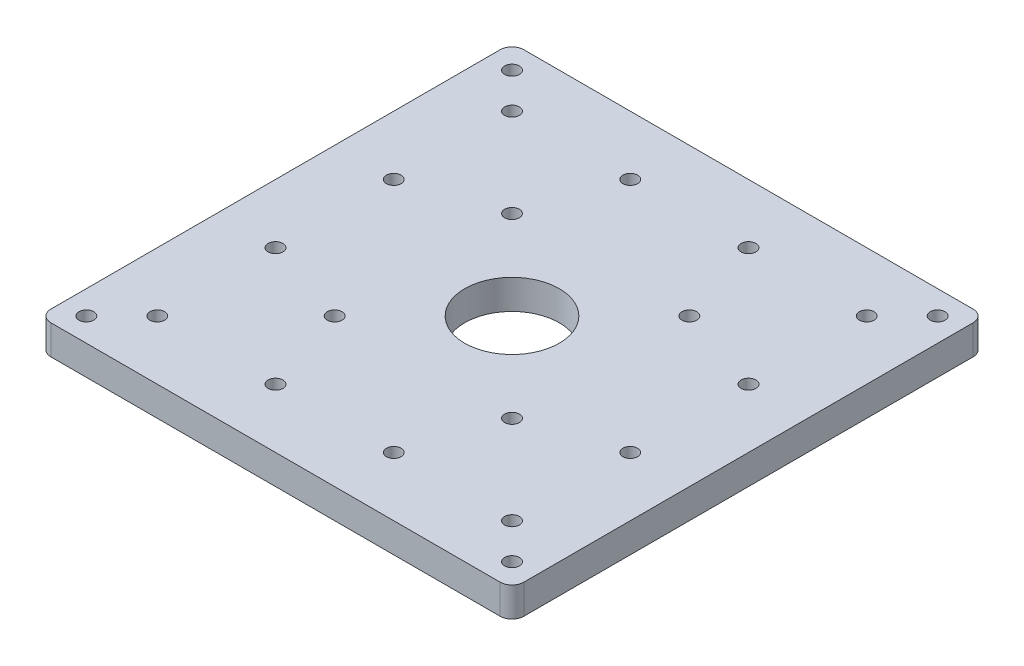
ISO-10303-21;
HEADER;
FILE_DESCRIPTION(('STEP AP214'),'2;1');
FILE_NAME('part.step','',(''),(''),'','','');
FILE_SCHEMA(('AUTOMOTIVE_DESIGN { 1 0 10303 214 1 1 1 1 }'));
ENDSEC;
DATA;
#1=APPLICATION_CONTEXT('core data for automotive mechanical design processes');
#2=APPLICATION_PROTOCOL_DEFINITION('international standard','automotive_design',2000,#1);
#3=PRODUCT_CONTEXT('',#1,'mechanical');
#4=PRODUCT('Part','Part','',(#3));
#5=PRODUCT_RELATED_PRODUCT_CATEGORY('part','',(#4));
#6=PRODUCT_DEFINITION_FORMATION('','',#4);
#7=PRODUCT_DEFINITION_CONTEXT('part definition',#1,'design');
#8=PRODUCT_DEFINITION('design','',#6,#7);
#9=PRODUCT_DEFINITION_SHAPE('','',#8);
#10=(LENGTH_UNIT() NAMED_UNIT(*) SI_UNIT(.MILLI.,.METRE.));
#11=(NAMED_UNIT(*) PLANE_ANGLE_UNIT() SI_UNIT($,.RADIAN.));
#12=(NAMED_UNIT(*) SI_UNIT($,.STERADIAN.) SOLID_ANGLE_UNIT());
#13=UNCERTAINTY_MEASURE_WITH_UNIT(LENGTH_MEASURE(1.E-05),#10,'distance_accuracy_value','');
#14=(GEOMETRIC_REPRESENTATION_CONTEXT(3) GLOBAL_UNCERTAINTY_ASSIGNED_CONTEXT((#13)) GLOBAL_UNIT_ASSIGNED_CONTEXT((#10,
#11,#12)) REPRESENTATION_CONTEXT('',''));
#15=CARTESIAN_POINT('',(0.,0.,0.));
#16=DIRECTION('',(0.,0.,1.));
#17=DIRECTION('',(1.,0.,0.));
#18=AXIS2_PLACEMENT_3D('',#15,#16,#17);
#19=CARTESIAN_POINT('',(-40.,5.,40.));
#20=DIRECTION('',(0.,1.,0.));
#21=DIRECTION('',(0.,0.,1.));
#22=AXIS2_PLACEMENT_3D('',#19,#20,#21);
#23=PLANE('',#22);
#24=CARTESIAN_POINT('',(30.,5.,30.));
#25=DIRECTION('',(0.,1.,0.));
#26=DIRECTION('',(0.,0.,1.));
#27=AXIS2_PLACEMENT_3D('',#24,#25,#26);
#28=CIRCLE('',#27,1.25);
#29=CARTESIAN_POINT('',(30.,5.,31.25));
#30=VERTEX_POINT('',#29);
#31=EDGE_CURVE('E301',#30,#30,#28,.T.);
#32=ORIENTED_EDGE('',*,*,#31,.F.);
#33=EDGE_LOOP('',(#32));
#34=FACE_BOUND('',#33,.T.);
#35=CARTESIAN_POINT('',(10.,5.,30.));
#36=DIRECTION('',(0.,1.,0.));
#37=DIRECTION('',(0.,0.,1.));
#38=AXIS2_PLACEMENT_3D('',#35,#36,#37);
#39=CIRCLE('',#38,1.25);
#40=CARTESIAN_POINT('',(10.,5.,31.25));
#41=VERTEX_POINT('',#40);
#42=EDGE_CURVE('E295',#41,#41,#39,.T.);
#43=ORIENTED_EDGE('',*,*,#42,.F.);
#44=EDGE_LOOP('',(#43));
#45=FACE_BOUND('',#44,.T.);
#46=CARTESIAN_POINT('',(-10.,5.,30.));
#47=DIRECTION('',(0.,1.,0.));
#48=DIRECTION('',(0.,0.,1.));
#49=AXIS2_PLACEMENT_3D('',#46,#47,#48);
#50=CIRCLE('',#49,1.25);
#51=CARTESIAN_POINT('',(-10.,5.,31.25));
#52=VERTEX_POINT('',#51);
#53=EDGE_CURVE('E289',#52,#52,#50,.T.);
#54=ORIENTED_EDGE('',*,*,#53,.F.);
#55=EDGE_LOOP('',(#54));
#56=FACE_BOUND('',#55,.T.);
#57=CARTESIAN_POINT('',(-30.,5.,30.));
#58=DIRECTION('',(0.,1.,0.));
#59=DIRECTION('',(0.,0.,1.));
#60=AXIS2_PLACEMENT_3D('',#57,#58,#59);
#61=CIRCLE('',#60,1.25);
#62=CARTESIAN_POINT('',(-30.,5.,31.25));
#63=VERTEX_POINT('',#62);
#64=EDGE_CURVE('E283',#63,#63,#61,.T.);
#65=ORIENTED_EDGE('',*,*,#64,.F.);
#66=EDGE_LOOP('',(#65));
#67=FACE_BOUND('',#66,.T.);
#68=CARTESIAN_POINT('',(30.,5.,10.));
#69=DIRECTION('',(0.,1.,0.));
#70=DIRECTION('',(0.,0.,1.));
#71=AXIS2_PLACEMENT_3D('',#68,#69,#70);
#72=CIRCLE('',#71,1.25);
#73=CARTESIAN_POINT('',(30.,5.,11.25));
#74=VERTEX_POINT('',#73);
#75=EDGE_CURVE('E277',#74,#74,#72,.T.);
#76=ORIENTED_EDGE('',*,*,#75,.F.);
#77=EDGE_LOOP('',(#76));
#78=FACE_BOUND('',#77,.T.);
#79=CARTESIAN_POINT('',(-30.,5.,10.));
#80=DIRECTION('',(0.,1.,0.));
#81=DIRECTION('',(0.,0.,1.));
#82=AXIS2_PLACEMENT_3D('',#79,#80,#81);
#83=CIRCLE('',#82,1.25);
#84=CARTESIAN_POINT('',(-30.,5.,11.25));
#85=VERTEX_POINT('',#84);
#86=EDGE_CURVE('E271',#85,#85,#83,.T.);
#87=ORIENTED_EDGE('',*,*,#86,.F.);
#88=EDGE_LOOP('',(#87));
#89=FACE_BOUND('',#88,.T.);
#90=CARTESIAN_POINT('',(30.,5.,-9.99999999999999));
#91=DIRECTION('',(0.,1.,0.));
#92=DIRECTION('',(0.,0.,1.));
#93=AXIS2_PLACEMENT_3D('',#90,#91,#92);
#94=CIRCLE('',#93,1.25);
#95=CARTESIAN_POINT('',(30.,5.,-8.75));
#96=VERTEX_POINT('',#95);
#97=EDGE_CURVE('E265',#96,#96,#94,.T.);
#98=ORIENTED_EDGE('',*,*,#97,.F.);
#99=EDGE_LOOP('',(#98));
#100=FACE_BOUND('',#99,.T.);
#101=CARTESIAN_POINT('',(-30.,5.,-10.));
#102=DIRECTION('',(0.,1.,0.));
#103=DIRECTION('',(0.,0.,1.));
#104=AXIS2_PLACEMENT_3D('',#101,#102,#103);
#105=CIRCLE('',#104,1.25);
#106=CARTESIAN_POINT('',(-30.,5.,-8.75));
#107=VERTEX_POINT('',#106);
#108=EDGE_CURVE('E259',#107,#107,#105,.T.);
#109=ORIENTED_EDGE('',*,*,#108,.F.);
#110=EDGE_LOOP('',(#109));
#111=FACE_BOUND('',#110,.T.);
#112=CARTESIAN_POINT('',(30.,5.,-30.));
#113=DIRECTION('',(0.,1.,0.));
#114=DIRECTION('',(0.,0.,1.));
#115=AXIS2_PLACEMENT_3D('',#112,#113,#114);
#116=CIRCLE('',#115,1.25);
#117=CARTESIAN_POINT('',(30.,5.,-28.75));
#118=VERTEX_POINT('',#117);
#119=EDGE_CURVE('E253',#118,#118,#116,.T.);
#120=ORIENTED_EDGE('',*,*,#119,.F.);
#121=EDGE_LOOP('',(#120));
#122=FACE_BOUND('',#121,.T.);
#123=CARTESIAN_POINT('',(10.,5.,-30.));
#124=DIRECTION('',(0.,1.,0.));
#125=DIRECTION('',(0.,0.,1.));
#126=AXIS2_PLACEMENT_3D('',#123,#124,#125);
#127=CIRCLE('',#126,1.25);
#128=CARTESIAN_POINT('',(10.,5.,-28.75));
#129=VERTEX_POINT('',#128);
#130=EDGE_CURVE('E247',#129,#129,#127,.T.);
#131=ORIENTED_EDGE('',*,*,#130,.F.);
#132=EDGE_LOOP('',(#131));
#133=FACE_BOUND('',#132,.T.);
#134=CARTESIAN_POINT('',(-10.,5.,-30.));
#135=DIRECTION('',(0.,1.,0.));
#136=DIRECTION('',(0.,0.,1.));
#137=AXIS2_PLACEMENT_3D('',#134,#135,#136);
#138=CIRCLE('',#137,1.25);
#139=CARTESIAN_POINT('',(-10.,5.,-28.75));
#140=VERTEX_POINT('',#139);
#141=EDGE_CURVE('E241',#140,#140,#138,.T.);
#142=ORIENTED_EDGE('',*,*,#141,.F.);
#143=EDGE_LOOP('',(#142));
#144=FACE_BOUND('',#143,.T.);
#145=CARTESIAN_POINT('',(-30.,5.,-30.));
#146=DIRECTION('',(0.,1.,0.));
#147=DIRECTION('',(0.,0.,1.));
#148=AXIS2_PLACEMENT_3D('',#145,#146,#147);
#149=CIRCLE('',#148,1.25);
#150=CARTESIAN_POINT('',(-30.,5.,-28.75));
#151=VERTEX_POINT('',#150);
#152=EDGE_CURVE('E235',#151,#151,#149,.T.);
#153=ORIENTED_EDGE('',*,*,#152,.F.);
#154=EDGE_LOOP('',(#153));
#155=FACE_BOUND('',#154,.T.);
#156=CARTESIAN_POINT('',(-36.,5.,36.));
#157=DIRECTION('',(0.,1.,0.));
#158=DIRECTION('',(0.,0.,-1.));
#159=AXIS2_PLACEMENT_3D('',#156,#157,#158);
#160=CIRCLE('',#159,1.25);
#161=CARTESIAN_POINT('',(-36.,5.,34.75));
#162=VERTEX_POINT('',#161);
#163=EDGE_CURVE('E220',#162,#162,#160,.T.);
#164=ORIENTED_EDGE('',*,*,#163,.F.);
#165=EDGE_LOOP('',(#164));
#166=FACE_BOUND('',#165,.T.);
#167=CARTESIAN_POINT('',(36.,5.,-36.));
#168=DIRECTION('',(0.,1.,0.));
#169=DIRECTION('',(0.,0.,-1.));
#170=AXIS2_PLACEMENT_3D('',#167,#168,#169);
#171=CIRCLE('',#170,1.25);
#172=CARTESIAN_POINT('',(36.,5.,-37.25));
#173=VERTEX_POINT('',#172);
#174=EDGE_CURVE('E208',#173,#173,#171,.T.);
#175=ORIENTED_EDGE('',*,*,#174,.F.);
#176=EDGE_LOOP('',(#175));
#177=FACE_BOUND('',#176,.T.);
#178=CARTESIAN_POINT('',(15.,5.,15.));
#179=DIRECTION('',(0.,1.,0.));
#180=DIRECTION('',(0.,0.,1.));
#181=AXIS2_PLACEMENT_3D('',#178,#179,#180);
#182=CIRCLE('',#181,1.25);
#183=CARTESIAN_POINT('',(15.,5.,16.25));
#184=VERTEX_POINT('',#183);
#185=EDGE_CURVE('E196',#184,#184,#182,.T.);
#186=ORIENTED_EDGE('',*,*,#185,.F.);
#187=EDGE_LOOP('',(#186));
#188=FACE_BOUND('',#187,.T.);
#189=CARTESIAN_POINT('',(15.,5.,-15.));
#190=DIRECTION('',(0.,1.,0.));
#191=DIRECTION('',(0.,0.,-1.));
#192=AXIS2_PLACEMENT_3D('',#189,#190,#191);
#193=CIRCLE('',#192,1.25);
#194=CARTESIAN_POINT('',(15.,5.,-16.25));
#195=VERTEX_POINT('',#194);
#196=EDGE_CURVE('E185',#195,#195,#193,.T.);
#197=ORIENTED_EDGE('',*,*,#196,.F.);
#198=EDGE_LOOP('',(#197));
#199=FACE_BOUND('',#198,.T.);
#200=DIRECTION('',(-1.,0.,0.));
#201=VECTOR('',#200,1.);
#202=CARTESIAN_POINT('',(-40.,5.,-40.));
#203=LINE('',#202,#201);
#204=CARTESIAN_POINT('',(38.,5.,-40.));
#205=VERTEX_POINT('',#204);
#206=CARTESIAN_POINT('',(-38.,5.,-40.));
#207=VERTEX_POINT('',#206);
#208=EDGE_CURVE('E140',#205,#207,#203,.T.);
#209=ORIENTED_EDGE('',*,*,#208,.T.);
#210=CARTESIAN_POINT('',(-38.,5.,-38.));
#211=DIRECTION('',(0.,1.,0.));
#212=DIRECTION('',(0.,0.,1.));
#213=AXIS2_PLACEMENT_3D('',#210,#211,#212);
#214=CIRCLE('',#213,2.);
#215=CARTESIAN_POINT('',(-40.,5.,-38.));
#216=VERTEX_POINT('',#215);
#217=EDGE_CURVE('E159',#207,#216,#214,.T.);
#218=ORIENTED_EDGE('',*,*,#217,.T.);
#219=DIRECTION('',(0.,0.,1.));
#220=VECTOR('',#219,1.);
#221=CARTESIAN_POINT('',(-40.,5.,-40.));
#222=LINE('',#221,#220);
#223=CARTESIAN_POINT('',(-40.,5.,38.));
#224=VERTEX_POINT('',#223);
#225=EDGE_CURVE('E123',#216,#224,#222,.T.);
#226=ORIENTED_EDGE('',*,*,#225,.T.);
#227=CARTESIAN_POINT('',(-38.,5.,38.));
#228=DIRECTION('',(0.,1.,0.));
#229=DIRECTION('',(0.,0.,1.));
#230=AXIS2_PLACEMENT_3D('',#227,#228,#229);
#231=CIRCLE('',#230,2.);
#232=CARTESIAN_POINT('',(-38.,5.,40.));
#233=VERTEX_POINT('',#232);
#234=EDGE_CURVE('E154',#224,#233,#231,.T.);
#235=ORIENTED_EDGE('',*,*,#234,.T.);
#236=DIRECTION('',(1.,0.,0.));
#237=VECTOR('',#236,1.);
#238=CARTESIAN_POINT('',(-40.,5.,40.));
#239=LINE('',#238,#237);
#240=CARTESIAN_POINT('',(38.,5.,40.));
#241=VERTEX_POINT('',#240);
#242=EDGE_CURVE('E170',#233,#241,#239,.T.);
#243=ORIENTED_EDGE('',*,*,#242,.T.);
#244=CARTESIAN_POINT('',(38.,5.,38.));
#245=DIRECTION('',(0.,1.,0.));
#246=DIRECTION('',(0.,0.,1.));
#247=AXIS2_PLACEMENT_3D('',#244,#245,#246);
#248=CIRCLE('',#247,2.);
#249=CARTESIAN_POINT('',(40.,5.,38.));
#250=VERTEX_POINT('',#249);
#251=EDGE_CURVE('E59',#241,#250,#248,.T.);
#252=ORIENTED_EDGE('',*,*,#251,.T.);
#253=DIRECTION('',(0.,0.,-1.));
#254=VECTOR('',#253,1.);
#255=CARTESIAN_POINT('',(40.,5.,-40.));
#256=LINE('',#255,#254);
#257=CARTESIAN_POINT('',(40.,5.,-38.));
#258=VERTEX_POINT('',#257);
#259=EDGE_CURVE('E178',#250,#258,#256,.T.);
#260=ORIENTED_EDGE('',*,*,#259,.T.);
#261=CARTESIAN_POINT('',(38.,5.,-38.));
#262=DIRECTION('',(0.,1.,0.));
#263=DIRECTION('',(0.,0.,1.));
#264=AXIS2_PLACEMENT_3D('',#261,#262,#263);
#265=CIRCLE('',#264,2.);
#266=EDGE_CURVE('E157',#258,#205,#265,.T.);
#267=ORIENTED_EDGE('',*,*,#266,.T.);
#268=EDGE_LOOP('',(#209,#218,#226,#235,#243,#252,#260,#267));
#269=FACE_BOUND('',#268,.T.);
#270=CARTESIAN_POINT('',(-15.,5.,-15.));
#271=DIRECTION('',(0.,1.,0.));
#272=DIRECTION('',(0.,0.,1.));
#273=AXIS2_PLACEMENT_3D('',#270,#271,#272);
#274=CIRCLE('',#273,1.25);
#275=CARTESIAN_POINT('',(-15.,5.,-13.75));
#276=VERTEX_POINT('',#275);
#277=EDGE_CURVE('E131',#276,#276,#274,.T.);
#278=ORIENTED_EDGE('',*,*,#277,.F.);
#279=EDGE_LOOP('',(#278));
#280=FACE_BOUND('',#279,.T.);
#281=CARTESIAN_POINT('',(-15.,5.,15.));
#282=DIRECTION('',(0.,1.,0.));
#283=DIRECTION('',(0.,0.,-1.));
#284=AXIS2_PLACEMENT_3D('',#281,#282,#283);
#285=CIRCLE('',#284,1.25);
#286=CARTESIAN_POINT('',(-15.,5.,13.75));
#287=VERTEX_POINT('',#286);
#288=EDGE_CURVE('E190',#287,#287,#285,.T.);
#289=ORIENTED_EDGE('',*,*,#288,.F.);
#290=EDGE_LOOP('',(#289));
#291=FACE_BOUND('',#290,.T.);
#292=CARTESIAN_POINT('',(-36.,5.,-36.));
#293=DIRECTION('',(0.,1.,0.));
#294=DIRECTION('',(0.,0.,1.));
#295=AXIS2_PLACEMENT_3D('',#292,#293,#294);
#296=CIRCLE('',#295,1.25);
#297=CARTESIAN_POINT('',(-36.,5.,-34.75));
#298=VERTEX_POINT('',#297);
#299=EDGE_CURVE('E202',#298,#298,#296,.T.);
#300=ORIENTED_EDGE('',*,*,#299,.F.);
#301=EDGE_LOOP('',(#300));
#302=FACE_BOUND('',#301,.T.);
#303=CARTESIAN_POINT('',(36.,5.,36.));
#304=DIRECTION('',(0.,1.,0.));
#305=DIRECTION('',(0.,0.,1.));
#306=AXIS2_PLACEMENT_3D('',#303,#304,#305);
#307=CIRCLE('',#306,1.25);
#308=CARTESIAN_POINT('',(36.,5.,37.25));
#309=VERTEX_POINT('',#308);
#310=EDGE_CURVE('E214',#309,#309,#307,.T.);
#311=ORIENTED_EDGE('',*,*,#310,.F.);
#312=EDGE_LOOP('',(#311));
#313=FACE_BOUND('',#312,.T.);
#314=CARTESIAN_POINT('',(0.,5.,0.));
#315=DIRECTION('',(0.,1.,0.));
#316=DIRECTION('',(0.,0.,1.));
#317=AXIS2_PLACEMENT_3D('',#314,#315,#316);
#318=CIRCLE('',#317,8.);
#319=CARTESIAN_POINT('',(0.,5.,8.));
#320=VERTEX_POINT('',#319);
#321=EDGE_CURVE('E226',#320,#320,#318,.T.);
#322=ORIENTED_EDGE('',*,*,#321,.F.);
#323=EDGE_LOOP('',(#322));
#324=FACE_BOUND('',#323,.T.);
#325=ADVANCED_FACE('F37',(#34,#45,#56,#67,#78,#89,#100,#111,#122,#133,#144,#155,#166,#177,#188,
#199,#269,#280,#291,#302,#313,#324),#23,.T.);
#326=CARTESIAN_POINT('',(-40.,0.,40.));
#327=DIRECTION('',(0.,1.,0.));
#328=DIRECTION('',(0.,0.,1.));
#329=AXIS2_PLACEMENT_3D('',#326,#327,#328);
#330=PLANE('',#329);
#331=CARTESIAN_POINT('',(30.,0.,30.));
#332=DIRECTION('',(0.,1.,0.));
#333=DIRECTION('',(0.,0.,1.));
#334=AXIS2_PLACEMENT_3D('',#331,#332,#333);
#335=CIRCLE('',#334,1.25);
#336=CARTESIAN_POINT('',(30.,0.,31.25));
#337=VERTEX_POINT('',#336);
#338=EDGE_CURVE('E298',#337,#337,#335,.T.);
#339=ORIENTED_EDGE('',*,*,#338,.T.);
#340=EDGE_LOOP('',(#339));
#341=FACE_BOUND('',#340,.T.);
#342=CARTESIAN_POINT('',(10.,0.,30.));
#343=DIRECTION('',(0.,1.,0.));
#344=DIRECTION('',(0.,0.,1.));
#345=AXIS2_PLACEMENT_3D('',#342,#343,#344);
#346=CIRCLE('',#345,1.25);
#347=CARTESIAN_POINT('',(10.,0.,31.25));
#348=VERTEX_POINT('',#347);
#349=EDGE_CURVE('E292',#348,#348,#346,.T.);
#350=ORIENTED_EDGE('',*,*,#349,.T.);
#351=EDGE_LOOP('',(#350));
#352=FACE_BOUND('',#351,.T.);
#353=CARTESIAN_POINT('',(-10.,0.,30.));
#354=DIRECTION('',(0.,1.,0.));
#355=DIRECTION('',(0.,0.,1.));
#356=AXIS2_PLACEMENT_3D('',#353,#354,#355);
#357=CIRCLE('',#356,1.25);
#358=CARTESIAN_POINT('',(-10.,0.,31.25));
#359=VERTEX_POINT('',#358);
#360=EDGE_CURVE('E286',#359,#359,#357,.T.);
#361=ORIENTED_EDGE('',*,*,#360,.T.);
#362=EDGE_LOOP('',(#361));
#363=FACE_BOUND('',#362,.T.);
#364=CARTESIAN_POINT('',(-30.,0.,30.));
#365=DIRECTION('',(0.,1.,0.));
#366=DIRECTION('',(0.,0.,1.));
#367=AXIS2_PLACEMENT_3D('',#364,#365,#366);
#368=CIRCLE('',#367,1.25);
#369=CARTESIAN_POINT('',(-30.,0.,31.25));
#370=VERTEX_POINT('',#369);
#371=EDGE_CURVE('E280',#370,#370,#368,.T.);
#372=ORIENTED_EDGE('',*,*,#371,.T.);
#373=EDGE_LOOP('',(#372));
#374=FACE_BOUND('',#373,.T.);
#375=CARTESIAN_POINT('',(30.,0.,10.));
#376=DIRECTION('',(0.,1.,0.));
#377=DIRECTION('',(0.,0.,1.));
#378=AXIS2_PLACEMENT_3D('',#375,#376,#377);
#379=CIRCLE('',#378,1.25);
#380=CARTESIAN_POINT('',(30.,0.,11.25));
#381=VERTEX_POINT('',#380);
#382=EDGE_CURVE('E274',#381,#381,#379,.T.);
#383=ORIENTED_EDGE('',*,*,#382,.T.);
#384=EDGE_LOOP('',(#383));
#385=FACE_BOUND('',#384,.T.);
#386=CARTESIAN_POINT('',(-30.,0.,10.));
#387=DIRECTION('',(0.,1.,0.));
#388=DIRECTION('',(0.,0.,1.));
#389=AXIS2_PLACEMENT_3D('',#386,#387,#388);
#390=CIRCLE('',#389,1.25);
#391=CARTESIAN_POINT('',(-30.,0.,11.25));
#392=VERTEX_POINT('',#391);
#393=EDGE_CURVE('E268',#392,#392,#390,.T.);
#394=ORIENTED_EDGE('',*,*,#393,.T.);
#395=EDGE_LOOP('',(#394));
#396=FACE_BOUND('',#395,.T.);
#397=CARTESIAN_POINT('',(30.,0.,-9.99999999999999));
#398=DIRECTION('',(0.,1.,0.));
#399=DIRECTION('',(0.,0.,1.));
#400=AXIS2_PLACEMENT_3D('',#397,#398,#399);
#401=CIRCLE('',#400,1.25);
#402=CARTESIAN_POINT('',(30.,0.,-8.75));
#403=VERTEX_POINT('',#402);
#404=EDGE_CURVE('E262',#403,#403,#401,.T.);
#405=ORIENTED_EDGE('',*,*,#404,.T.);
#406=EDGE_LOOP('',(#405));
#407=FACE_BOUND('',#406,.T.);
#408=CARTESIAN_POINT('',(-30.,0.,-10.));
#409=DIRECTION('',(0.,1.,0.));
#410=DIRECTION('',(0.,0.,1.));
#411=AXIS2_PLACEMENT_3D('',#408,#409,#410);
#412=CIRCLE('',#411,1.25);
#413=CARTESIAN_POINT('',(-30.,0.,-8.75));
#414=VERTEX_POINT('',#413);
#415=EDGE_CURVE('E256',#414,#414,#412,.T.);
#416=ORIENTED_EDGE('',*,*,#415,.T.);
#417=EDGE_LOOP('',(#416));
#418=FACE_BOUND('',#417,.T.);
#419=CARTESIAN_POINT('',(30.,0.,-30.));
#420=DIRECTION('',(0.,1.,0.));
#421=DIRECTION('',(0.,0.,1.));
#422=AXIS2_PLACEMENT_3D('',#419,#420,#421);
#423=CIRCLE('',#422,1.25);
#424=CARTESIAN_POINT('',(30.,0.,-28.75));
#425=VERTEX_POINT('',#424);
#426=EDGE_CURVE('E250',#425,#425,#423,.T.);
#427=ORIENTED_EDGE('',*,*,#426,.T.);
#428=EDGE_LOOP('',(#427));
#429=FACE_BOUND('',#428,.T.);
#430=CARTESIAN_POINT('',(10.,0.,-30.));
#431=DIRECTION('',(0.,1.,0.));
#432=DIRECTION('',(0.,0.,1.));
#433=AXIS2_PLACEMENT_3D('',#430,#431,#432);
#434=CIRCLE('',#433,1.25);
#435=CARTESIAN_POINT('',(10.,0.,-28.75));
#436=VERTEX_POINT('',#435);
#437=EDGE_CURVE('E244',#436,#436,#434,.T.);
#438=ORIENTED_EDGE('',*,*,#437,.T.);
#439=EDGE_LOOP('',(#438));
#440=FACE_BOUND('',#439,.T.);
#441=CARTESIAN_POINT('',(-10.,0.,-30.));
#442=DIRECTION('',(0.,1.,0.));
#443=DIRECTION('',(0.,0.,1.));
#444=AXIS2_PLACEMENT_3D('',#441,#442,#443);
#445=CIRCLE('',#444,1.25);
#446=CARTESIAN_POINT('',(-10.,0.,-28.75));
#447=VERTEX_POINT('',#446);
#448=EDGE_CURVE('E238',#447,#447,#445,.T.);
#449=ORIENTED_EDGE('',*,*,#448,.T.);
#450=EDGE_LOOP('',(#449));
#451=FACE_BOUND('',#450,.T.);
#452=CARTESIAN_POINT('',(-30.,0.,-30.));
#453=DIRECTION('',(0.,1.,0.));
#454=DIRECTION('',(0.,0.,1.));
#455=AXIS2_PLACEMENT_3D('',#452,#453,#454);
#456=CIRCLE('',#455,1.25);
#457=CARTESIAN_POINT('',(-30.,0.,-28.75));
#458=VERTEX_POINT('',#457);
#459=EDGE_CURVE('E232',#458,#458,#456,.T.);
#460=ORIENTED_EDGE('',*,*,#459,.T.);
#461=EDGE_LOOP('',(#460));
#462=FACE_BOUND('',#461,.T.);
#463=CARTESIAN_POINT('',(-36.,0.,36.));
#464=DIRECTION('',(0.,1.,0.));
#465=DIRECTION('',(0.,0.,-1.));
#466=AXIS2_PLACEMENT_3D('',#463,#464,#465);
#467=CIRCLE('',#466,1.25);
#468=CARTESIAN_POINT('',(-36.,0.,34.75));
#469=VERTEX_POINT('',#468);
#470=EDGE_CURVE('E223',#469,#469,#467,.T.);
#471=ORIENTED_EDGE('',*,*,#470,.T.);
#472=EDGE_LOOP('',(#471));
#473=FACE_BOUND('',#472,.T.);
#474=CARTESIAN_POINT('',(36.,0.,-36.));
#475=DIRECTION('',(0.,1.,0.));
#476=DIRECTION('',(0.,0.,-1.));
#477=AXIS2_PLACEMENT_3D('',#474,#475,#476);
#478=CIRCLE('',#477,1.25);
#479=CARTESIAN_POINT('',(36.,0.,-37.25));
#480=VERTEX_POINT('',#479);
#481=EDGE_CURVE('E211',#480,#480,#478,.T.);
#482=ORIENTED_EDGE('',*,*,#481,.T.);
#483=EDGE_LOOP('',(#482));
#484=FACE_BOUND('',#483,.T.);
#485=CARTESIAN_POINT('',(15.,0.,15.));
#486=DIRECTION('',(0.,1.,0.));
#487=DIRECTION('',(0.,0.,1.));
#488=AXIS2_PLACEMENT_3D('',#485,#486,#487);
#489=CIRCLE('',#488,1.25);
#490=CARTESIAN_POINT('',(15.,0.,16.25));
#491=VERTEX_POINT('',#490);
#492=EDGE_CURVE('E199',#491,#491,#489,.T.);
#493=ORIENTED_EDGE('',*,*,#492,.T.);
#494=EDGE_LOOP('',(#493));
#495=FACE_BOUND('',#494,.T.);
#496=CARTESIAN_POINT('',(15.,0.,-15.));
#497=DIRECTION('',(0.,1.,0.));
#498=DIRECTION('',(0.,0.,-1.));
#499=AXIS2_PLACEMENT_3D('',#496,#497,#498);
#500=CIRCLE('',#499,1.25);
#501=CARTESIAN_POINT('',(15.,0.,-16.25));
#502=VERTEX_POINT('',#501);
#503=EDGE_CURVE('E187',#502,#502,#500,.T.);
#504=ORIENTED_EDGE('',*,*,#503,.T.);
#505=EDGE_LOOP('',(#504));
#506=FACE_BOUND('',#505,.T.);
#507=DIRECTION('',(0.,0.,1.));
#508=VECTOR('',#507,1.);
#509=CARTESIAN_POINT('',(-40.,0.,-40.));
#510=LINE('',#509,#508);
#511=CARTESIAN_POINT('',(-40.,0.,-38.));
#512=VERTEX_POINT('',#511);
#513=CARTESIAN_POINT('',(-40.,0.,38.));
#514=VERTEX_POINT('',#513);
#515=EDGE_CURVE('E120',#512,#514,#510,.T.);
#516=ORIENTED_EDGE('',*,*,#515,.F.);
#517=CARTESIAN_POINT('',(-38.,0.,-38.));
#518=DIRECTION('',(0.,1.,0.));
#519=DIRECTION('',(0.,0.,1.));
#520=AXIS2_PLACEMENT_3D('',#517,#518,#519);
#521=CIRCLE('',#520,2.);
#522=CARTESIAN_POINT('',(-38.,0.,-40.));
#523=VERTEX_POINT('',#522);
#524=EDGE_CURVE('E103',#512,#523,#521,.F.);
#525=ORIENTED_EDGE('',*,*,#524,.T.);
#526=DIRECTION('',(-1.,0.,0.));
#527=VECTOR('',#526,1.);
#528=CARTESIAN_POINT('',(-40.,0.,-40.));
#529=LINE('',#528,#527);
#530=CARTESIAN_POINT('',(38.,0.,-40.));
#531=VERTEX_POINT('',#530);
#532=EDGE_CURVE('E144',#531,#523,#529,.T.);
#533=ORIENTED_EDGE('',*,*,#532,.F.);
#534=CARTESIAN_POINT('',(38.,0.,-38.));
#535=DIRECTION('',(0.,1.,0.));
#536=DIRECTION('',(0.,0.,1.));
#537=AXIS2_PLACEMENT_3D('',#534,#535,#536);
#538=CIRCLE('',#537,2.);
#539=CARTESIAN_POINT('',(40.,0.,-38.));
#540=VERTEX_POINT('',#539);
#541=EDGE_CURVE('E114',#531,#540,#538,.F.);
#542=ORIENTED_EDGE('',*,*,#541,.T.);
#543=DIRECTION('',(0.,0.,-1.));
#544=VECTOR('',#543,1.);
#545=CARTESIAN_POINT('',(40.,0.,-40.));
#546=LINE('',#545,#544);
#547=CARTESIAN_POINT('',(40.,0.,38.));
#548=VERTEX_POINT('',#547);
#549=EDGE_CURVE('E134',#548,#540,#546,.T.);
#550=ORIENTED_EDGE('',*,*,#549,.F.);
#551=CARTESIAN_POINT('',(38.,0.,38.));
#552=DIRECTION('',(0.,1.,0.));
#553=DIRECTION('',(0.,0.,1.));
#554=AXIS2_PLACEMENT_3D('',#551,#552,#553);
#555=CIRCLE('',#554,2.);
#556=CARTESIAN_POINT('',(38.,0.,40.));
#557=VERTEX_POINT('',#556);
#558=EDGE_CURVE('E148',#548,#557,#555,.F.);
#559=ORIENTED_EDGE('',*,*,#558,.T.);
#560=DIRECTION('',(1.,0.,0.));
#561=VECTOR('',#560,1.);
#562=CARTESIAN_POINT('',(-40.,0.,40.));
#563=LINE('',#562,#561);
#564=CARTESIAN_POINT('',(-38.,0.,40.));
#565=VERTEX_POINT('',#564);
#566=EDGE_CURVE('E130',#565,#557,#563,.T.);
#567=ORIENTED_EDGE('',*,*,#566,.F.);
#568=CARTESIAN_POINT('',(-38.,0.,38.));
#569=DIRECTION('',(0.,1.,0.));
#570=DIRECTION('',(0.,0.,1.));
#571=AXIS2_PLACEMENT_3D('',#568,#569,#570);
#572=CIRCLE('',#571,2.);
#573=EDGE_CURVE('E124',#565,#514,#572,.F.);
#574=ORIENTED_EDGE('',*,*,#573,.T.);
#575=EDGE_LOOP('',(#516,#525,#533,#542,#550,#559,#567,#574));
#576=FACE_BOUND('',#575,.T.);
#577=CARTESIAN_POINT('',(-15.,0.,-15.));
#578=DIRECTION('',(0.,1.,0.));
#579=DIRECTION('',(0.,0.,1.));
#580=AXIS2_PLACEMENT_3D('',#577,#578,#579);
#581=CIRCLE('',#580,1.25);
#582=CARTESIAN_POINT('',(-15.,0.,-13.75));
#583=VERTEX_POINT('',#582);
#584=EDGE_CURVE('E137',#583,#583,#581,.T.);
#585=ORIENTED_EDGE('',*,*,#584,.T.);
#586=EDGE_LOOP('',(#585));
#587=FACE_BOUND('',#586,.T.);
#588=CARTESIAN_POINT('',(-15.,0.,15.));
#589=DIRECTION('',(0.,1.,0.));
#590=DIRECTION('',(0.,0.,-1.));
#591=AXIS2_PLACEMENT_3D('',#588,#589,#590);
#592=CIRCLE('',#591,1.25);
#593=CARTESIAN_POINT('',(-15.,0.,13.75));
#594=VERTEX_POINT('',#593);
#595=EDGE_CURVE('E193',#594,#594,#592,.T.);
#596=ORIENTED_EDGE('',*,*,#595,.T.);
#597=EDGE_LOOP('',(#596));
#598=FACE_BOUND('',#597,.T.);
#599=CARTESIAN_POINT('',(-36.,0.,-36.));
#600=DIRECTION('',(0.,1.,0.));
#601=DIRECTION('',(0.,0.,1.));
#602=AXIS2_PLACEMENT_3D('',#599,#600,#601);
#603=CIRCLE('',#602,1.25);
#604=CARTESIAN_POINT('',(-36.,0.,-34.75));
#605=VERTEX_POINT('',#604);
#606=EDGE_CURVE('E205',#605,#605,#603,.T.);
#607=ORIENTED_EDGE('',*,*,#606,.T.);
#608=EDGE_LOOP('',(#607));
#609=FACE_BOUND('',#608,.T.);
#610=CARTESIAN_POINT('',(36.,0.,36.));
#611=DIRECTION('',(0.,1.,0.));
#612=DIRECTION('',(0.,0.,1.));
#613=AXIS2_PLACEMENT_3D('',#610,#611,#612);
#614=CIRCLE('',#613,1.25);
#615=CARTESIAN_POINT('',(36.,0.,37.25));
#616=VERTEX_POINT('',#615);
#617=EDGE_CURVE('E217',#616,#616,#614,.T.);
#618=ORIENTED_EDGE('',*,*,#617,.T.);
#619=EDGE_LOOP('',(#618));
#620=FACE_BOUND('',#619,.T.);
#621=CARTESIAN_POINT('',(0.,0.,0.));
#622=DIRECTION('',(0.,1.,0.));
#623=DIRECTION('',(0.,0.,1.));
#624=AXIS2_PLACEMENT_3D('',#621,#622,#623);
#625=CIRCLE('',#624,8.);
#626=CARTESIAN_POINT('',(0.,0.,8.));
#627=VERTEX_POINT('',#626);
#628=EDGE_CURVE('E229',#627,#627,#625,.T.);
#629=ORIENTED_EDGE('',*,*,#628,.T.);
#630=EDGE_LOOP('',(#629));
#631=FACE_BOUND('',#630,.T.);
#632=ADVANCED_FACE('F127',(#341,#352,#363,#374,#385,#396,#407,#418,#429,#440,#451,#462,#473,
#484,#495,#506,#576,#587,#598,#609,#620,#631),#330,.F.);
#633=CARTESIAN_POINT('',(-40.,5.,-40.));
#634=DIRECTION('',(1.,0.,0.));
#635=DIRECTION('',(0.,0.,-1.));
#636=AXIS2_PLACEMENT_3D('',#633,#634,#635);
#637=PLANE('',#636);
#638=ORIENTED_EDGE('',*,*,#225,.F.);
#639=DIRECTION('',(0.,-1.,0.));
#640=VECTOR('',#639,1.);
#641=CARTESIAN_POINT('',(-40.,5.,-38.));
#642=LINE('',#641,#640);
#643=EDGE_CURVE('E107',#216,#512,#642,.T.);
#644=ORIENTED_EDGE('',*,*,#643,.T.);
#645=ORIENTED_EDGE('',*,*,#515,.T.);
#646=DIRECTION('',(0.,-1.,0.));
#647=VECTOR('',#646,1.);
#648=CARTESIAN_POINT('',(-40.,5.,38.));
#649=LINE('',#648,#647);
#650=EDGE_CURVE('E125',#514,#224,#649,.F.);
#651=ORIENTED_EDGE('',*,*,#650,.T.);
#652=EDGE_LOOP('',(#638,#644,#645,#651));
#653=FACE_BOUND('',#652,.T.);
#654=ADVANCED_FACE('F119',(#653),#637,.F.);
#655=CARTESIAN_POINT('',(-40.,5.,40.));
#656=DIRECTION('',(0.,0.,-1.));
#657=DIRECTION('',(-1.,0.,0.));
#658=AXIS2_PLACEMENT_3D('',#655,#656,#657);
#659=PLANE('',#658);
#660=ORIENTED_EDGE('',*,*,#566,.T.);
#661=DIRECTION('',(0.,-1.,0.));
#662=VECTOR('',#661,1.);
#663=CARTESIAN_POINT('',(38.,5.,40.));
#664=LINE('',#663,#662);
#665=EDGE_CURVE('E11',#557,#241,#664,.F.);
#666=ORIENTED_EDGE('',*,*,#665,.T.);
#667=ORIENTED_EDGE('',*,*,#242,.F.);
#668=DIRECTION('',(0.,-1.,0.));
#669=VECTOR('',#668,1.);
#670=CARTESIAN_POINT('',(-38.,5.,40.));
#671=LINE('',#670,#669);
#672=EDGE_CURVE('E45',#233,#565,#671,.T.);
#673=ORIENTED_EDGE('',*,*,#672,.T.);
#674=EDGE_LOOP('',(#660,#666,#667,#673));
#675=FACE_BOUND('',#674,.T.);
#676=ADVANCED_FACE('F168',(#675),#659,.F.);
#677=CARTESIAN_POINT('',(40.,5.,-40.));
#678=DIRECTION('',(-1.,0.,0.));
#679=DIRECTION('',(0.,0.,1.));
#680=AXIS2_PLACEMENT_3D('',#677,#678,#679);
#681=PLANE('',#680);
#682=ORIENTED_EDGE('',*,*,#549,.T.);
#683=DIRECTION('',(0.,-1.,0.));
#684=VECTOR('',#683,1.);
#685=CARTESIAN_POINT('',(40.,5.,-38.));
#686=LINE('',#685,#684);
#687=EDGE_CURVE('E52',#540,#258,#686,.F.);
#688=ORIENTED_EDGE('',*,*,#687,.T.);
#689=ORIENTED_EDGE('',*,*,#259,.F.);
#690=DIRECTION('',(0.,-1.,0.));
#691=VECTOR('',#690,1.);
#692=CARTESIAN_POINT('',(40.,5.,38.));
#693=LINE('',#692,#691);
#694=EDGE_CURVE('E161',#250,#548,#693,.T.);
#695=ORIENTED_EDGE('',*,*,#694,.T.);
#696=EDGE_LOOP('',(#682,#688,#689,#695));
#697=FACE_BOUND('',#696,.T.);
#698=ADVANCED_FACE('F177',(#697),#681,.F.);
#699=CARTESIAN_POINT('',(-40.,5.,-40.));
#700=DIRECTION('',(0.,0.,1.));
#701=DIRECTION('',(1.,0.,0.));
#702=AXIS2_PLACEMENT_3D('',#699,#700,#701);
#703=PLANE('',#702);
#704=ORIENTED_EDGE('',*,*,#532,.T.);
#705=DIRECTION('',(0.,-1.,0.));
#706=VECTOR('',#705,1.);
#707=CARTESIAN_POINT('',(-38.,5.,-40.));
#708=LINE('',#707,#706);
#709=EDGE_CURVE('E108',#523,#207,#708,.F.);
#710=ORIENTED_EDGE('',*,*,#709,.T.);
#711=ORIENTED_EDGE('',*,*,#208,.F.);
#712=DIRECTION('',(0.,-1.,0.));
#713=VECTOR('',#712,1.);
#714=CARTESIAN_POINT('',(38.,5.,-40.));
#715=LINE('',#714,#713);
#716=EDGE_CURVE('E113',#205,#531,#715,.T.);
#717=ORIENTED_EDGE('',*,*,#716,.T.);
#718=EDGE_LOOP('',(#704,#710,#711,#717));
#719=FACE_BOUND('',#718,.T.);
#720=ADVANCED_FACE('F376',(#719),#703,.F.);
#721=CARTESIAN_POINT('',(-15.,5.,-15.));
#722=DIRECTION('',(0.,-1.,0.));
#723=DIRECTION('',(0.,0.,-1.));
#724=AXIS2_PLACEMENT_3D('',#721,#722,#723);
#725=CYLINDRICAL_SURFACE('',#724,1.25);
#726=ORIENTED_EDGE('',*,*,#277,.T.);
#727=EDGE_LOOP('',(#726));
#728=FACE_BOUND('',#727,.T.);
#729=ORIENTED_EDGE('',*,*,#584,.F.);
#730=EDGE_LOOP('',(#729));
#731=FACE_BOUND('',#730,.T.);
#732=ADVANCED_FACE('F379',(#728,#731),#725,.F.);
#733=CARTESIAN_POINT('',(15.,5.,-15.));
#734=DIRECTION('',(0.,-1.,0.));
#735=DIRECTION('',(0.,0.,-1.));
#736=AXIS2_PLACEMENT_3D('',#733,#734,#735);
#737=CYLINDRICAL_SURFACE('',#736,1.25);
#738=ORIENTED_EDGE('',*,*,#196,.T.);
#739=EDGE_LOOP('',(#738));
#740=FACE_BOUND('',#739,.T.);
#741=ORIENTED_EDGE('',*,*,#503,.F.);
#742=EDGE_LOOP('',(#741));
#743=FACE_BOUND('',#742,.T.);
#744=ADVANCED_FACE('F638',(#740,#743),#737,.F.);
#745=CARTESIAN_POINT('',(-15.,5.,15.));
#746=DIRECTION('',(0.,-1.,0.));
#747=DIRECTION('',(0.,0.,-1.));
#748=AXIS2_PLACEMENT_3D('',#745,#746,#747);
#749=CYLINDRICAL_SURFACE('',#748,1.25);
#750=ORIENTED_EDGE('',*,*,#288,.T.);
#751=EDGE_LOOP('',(#750));
#752=FACE_BOUND('',#751,.T.);
#753=ORIENTED_EDGE('',*,*,#595,.F.);
#754=EDGE_LOOP('',(#753));
#755=FACE_BOUND('',#754,.T.);
#756=ADVANCED_FACE('F628',(#752,#755),#749,.F.);
#757=CARTESIAN_POINT('',(15.,5.,15.));
#758=DIRECTION('',(0.,-1.,0.));
#759=DIRECTION('',(0.,0.,-1.));
#760=AXIS2_PLACEMENT_3D('',#757,#758,#759);
#761=CYLINDRICAL_SURFACE('',#760,1.25);
#762=ORIENTED_EDGE('',*,*,#185,.T.);
#763=EDGE_LOOP('',(#762));
#764=FACE_BOUND('',#763,.T.);
#765=ORIENTED_EDGE('',*,*,#492,.F.);
#766=EDGE_LOOP('',(#765));
#767=FACE_BOUND('',#766,.T.);
#768=ADVANCED_FACE('F618',(#764,#767),#761,.F.);
#769=CARTESIAN_POINT('',(-36.,5.,-36.));
#770=DIRECTION('',(0.,-1.,0.));
#771=DIRECTION('',(0.,0.,-1.));
#772=AXIS2_PLACEMENT_3D('',#769,#770,#771);
#773=CYLINDRICAL_SURFACE('',#772,1.25);
#774=ORIENTED_EDGE('',*,*,#299,.T.);
#775=EDGE_LOOP('',(#774));
#776=FACE_BOUND('',#775,.T.);
#777=ORIENTED_EDGE('',*,*,#606,.F.);
#778=EDGE_LOOP('',(#777));
#779=FACE_BOUND('',#778,.T.);
#780=ADVANCED_FACE('F608',(#776,#779),#773,.F.);
#781=CARTESIAN_POINT('',(36.,5.,-36.));
#782=DIRECTION('',(0.,-1.,0.));
#783=DIRECTION('',(0.,0.,-1.));
#784=AXIS2_PLACEMENT_3D('',#781,#782,#783);
#785=CYLINDRICAL_SURFACE('',#784,1.25);
#786=ORIENTED_EDGE('',*,*,#174,.T.);
#787=EDGE_LOOP('',(#786));
#788=FACE_BOUND('',#787,.T.);
#789=ORIENTED_EDGE('',*,*,#481,.F.);
#790=EDGE_LOOP('',(#789));
#791=FACE_BOUND('',#790,.T.);
#792=ADVANCED_FACE('F598',(#788,#791),#785,.F.);
#793=CARTESIAN_POINT('',(36.,5.,36.));
#794=DIRECTION('',(0.,-1.,0.));
#795=DIRECTION('',(0.,0.,-1.));
#796=AXIS2_PLACEMENT_3D('',#793,#794,#795);
#797=CYLINDRICAL_SURFACE('',#796,1.25);
#798=ORIENTED_EDGE('',*,*,#310,.T.);
#799=EDGE_LOOP('',(#798));
#800=FACE_BOUND('',#799,.T.);
#801=ORIENTED_EDGE('',*,*,#617,.F.);
#802=EDGE_LOOP('',(#801));
#803=FACE_BOUND('',#802,.T.);
#804=ADVANCED_FACE('F588',(#800,#803),#797,.F.);
#805=CARTESIAN_POINT('',(-36.,5.,36.));
#806=DIRECTION('',(0.,-1.,0.));
#807=DIRECTION('',(0.,0.,-1.));
#808=AXIS2_PLACEMENT_3D('',#805,#806,#807);
#809=CYLINDRICAL_SURFACE('',#808,1.25);
#810=ORIENTED_EDGE('',*,*,#163,.T.);
#811=EDGE_LOOP('',(#810));
#812=FACE_BOUND('',#811,.T.);
#813=ORIENTED_EDGE('',*,*,#470,.F.);
#814=EDGE_LOOP('',(#813));
#815=FACE_BOUND('',#814,.T.);
#816=ADVANCED_FACE('F364',(#812,#815),#809,.F.);
#817=CARTESIAN_POINT('',(0.,5.,0.));
#818=DIRECTION('',(0.,-1.,0.));
#819=DIRECTION('',(0.,0.,-1.));
#820=AXIS2_PLACEMENT_3D('',#817,#818,#819);
#821=CYLINDRICAL_SURFACE('',#820,8.);
#822=ORIENTED_EDGE('',*,*,#321,.T.);
#823=EDGE_LOOP('',(#822));
#824=FACE_BOUND('',#823,.T.);
#825=ORIENTED_EDGE('',*,*,#628,.F.);
#826=EDGE_LOOP('',(#825));
#827=FACE_BOUND('',#826,.T.);
#828=ADVANCED_FACE('F360',(#824,#827),#821,.F.);
#829=CARTESIAN_POINT('',(-30.,0.,-30.));
#830=DIRECTION('',(0.,1.,0.));
#831=DIRECTION('',(0.,0.,1.));
#832=AXIS2_PLACEMENT_3D('',#829,#830,#831);
#833=CYLINDRICAL_SURFACE('',#832,1.25);
#834=ORIENTED_EDGE('',*,*,#459,.F.);
#835=EDGE_LOOP('',(#834));
#836=FACE_BOUND('',#835,.T.);
#837=ORIENTED_EDGE('',*,*,#152,.T.);
#838=EDGE_LOOP('',(#837));
#839=FACE_BOUND('',#838,.T.);
#840=ADVANCED_FACE('F363',(#836,#839),#833,.F.);
#841=CARTESIAN_POINT('',(-10.,0.,-30.));
#842=DIRECTION('',(0.,1.,0.));
#843=DIRECTION('',(0.,0.,1.));
#844=AXIS2_PLACEMENT_3D('',#841,#842,#843);
#845=CYLINDRICAL_SURFACE('',#844,1.25);
#846=ORIENTED_EDGE('',*,*,#448,.F.);
#847=EDGE_LOOP('',(#846));
#848=FACE_BOUND('',#847,.T.);
#849=ORIENTED_EDGE('',*,*,#141,.T.);
#850=EDGE_LOOP('',(#849));
#851=FACE_BOUND('',#850,.T.);
#852=ADVANCED_FACE('F553',(#848,#851),#845,.F.);
#853=CARTESIAN_POINT('',(10.,0.,-30.));
#854=DIRECTION('',(0.,1.,0.));
#855=DIRECTION('',(0.,0.,1.));
#856=AXIS2_PLACEMENT_3D('',#853,#854,#855);
#857=CYLINDRICAL_SURFACE('',#856,1.25);
#858=ORIENTED_EDGE('',*,*,#437,.F.);
#859=EDGE_LOOP('',(#858));
#860=FACE_BOUND('',#859,.T.);
#861=ORIENTED_EDGE('',*,*,#130,.T.);
#862=EDGE_LOOP('',(#861));
#863=FACE_BOUND('',#862,.T.);
#864=ADVANCED_FACE('F542',(#860,#863),#857,.F.);
#865=CARTESIAN_POINT('',(30.,0.,-30.));
#866=DIRECTION('',(0.,1.,0.));
#867=DIRECTION('',(0.,0.,1.));
#868=AXIS2_PLACEMENT_3D('',#865,#866,#867);
#869=CYLINDRICAL_SURFACE('',#868,1.25);
#870=ORIENTED_EDGE('',*,*,#426,.F.);
#871=EDGE_LOOP('',(#870));
#872=FACE_BOUND('',#871,.T.);
#873=ORIENTED_EDGE('',*,*,#119,.T.);
#874=EDGE_LOOP('',(#873));
#875=FACE_BOUND('',#874,.T.);
#876=ADVANCED_FACE('F531',(#872,#875),#869,.F.);
#877=CARTESIAN_POINT('',(-30.,0.,-10.));
#878=DIRECTION('',(0.,1.,0.));
#879=DIRECTION('',(0.,0.,1.));
#880=AXIS2_PLACEMENT_3D('',#877,#878,#879);
#881=CYLINDRICAL_SURFACE('',#880,1.25);
#882=ORIENTED_EDGE('',*,*,#415,.F.);
#883=EDGE_LOOP('',(#882));
#884=FACE_BOUND('',#883,.T.);
#885=ORIENTED_EDGE('',*,*,#108,.T.);
#886=EDGE_LOOP('',(#885));
#887=FACE_BOUND('',#886,.T.);
#888=ADVANCED_FACE('F520',(#884,#887),#881,.F.);
#889=CARTESIAN_POINT('',(30.,0.,-9.99999999999999));
#890=DIRECTION('',(0.,1.,0.));
#891=DIRECTION('',(0.,0.,1.));
#892=AXIS2_PLACEMENT_3D('',#889,#890,#891);
#893=CYLINDRICAL_SURFACE('',#892,1.25);
#894=ORIENTED_EDGE('',*,*,#404,.F.);
#895=EDGE_LOOP('',(#894));
#896=FACE_BOUND('',#895,.T.);
#897=ORIENTED_EDGE('',*,*,#97,.T.);
#898=EDGE_LOOP('',(#897));
#899=FACE_BOUND('',#898,.T.);
#900=ADVANCED_FACE('F509',(#896,#899),#893,.F.);
#901=CARTESIAN_POINT('',(-30.,0.,10.));
#902=DIRECTION('',(0.,1.,0.));
#903=DIRECTION('',(0.,0.,1.));
#904=AXIS2_PLACEMENT_3D('',#901,#902,#903);
#905=CYLINDRICAL_SURFACE('',#904,1.25);
#906=ORIENTED_EDGE('',*,*,#393,.F.);
#907=EDGE_LOOP('',(#906));
#908=FACE_BOUND('',#907,.T.);
#909=ORIENTED_EDGE('',*,*,#86,.T.);
#910=EDGE_LOOP('',(#909));
#911=FACE_BOUND('',#910,.T.);
#912=ADVANCED_FACE('F498',(#908,#911),#905,.F.);
#913=CARTESIAN_POINT('',(30.,0.,10.));
#914=DIRECTION('',(0.,1.,0.));
#915=DIRECTION('',(0.,0.,1.));
#916=AXIS2_PLACEMENT_3D('',#913,#914,#915);
#917=CYLINDRICAL_SURFACE('',#916,1.25);
#918=ORIENTED_EDGE('',*,*,#382,.F.);
#919=EDGE_LOOP('',(#918));
#920=FACE_BOUND('',#919,.T.);
#921=ORIENTED_EDGE('',*,*,#75,.T.);
#922=EDGE_LOOP('',(#921));
#923=FACE_BOUND('',#922,.T.);
#924=ADVANCED_FACE('F487',(#920,#923),#917,.F.);
#925=CARTESIAN_POINT('',(-30.,0.,30.));
#926=DIRECTION('',(0.,1.,0.));
#927=DIRECTION('',(0.,0.,1.));
#928=AXIS2_PLACEMENT_3D('',#925,#926,#927);
#929=CYLINDRICAL_SURFACE('',#928,1.25);
#930=ORIENTED_EDGE('',*,*,#371,.F.);
#931=EDGE_LOOP('',(#930));
#932=FACE_BOUND('',#931,.T.);
#933=ORIENTED_EDGE('',*,*,#64,.T.);
#934=EDGE_LOOP('',(#933));
#935=FACE_BOUND('',#934,.T.);
#936=ADVANCED_FACE('F476',(#932,#935),#929,.F.);
#937=CARTESIAN_POINT('',(-10.,0.,30.));
#938=DIRECTION('',(0.,1.,0.));
#939=DIRECTION('',(0.,0.,1.));
#940=AXIS2_PLACEMENT_3D('',#937,#938,#939);
#941=CYLINDRICAL_SURFACE('',#940,1.25);
#942=ORIENTED_EDGE('',*,*,#360,.F.);
#943=EDGE_LOOP('',(#942));
#944=FACE_BOUND('',#943,.T.);
#945=ORIENTED_EDGE('',*,*,#53,.T.);
#946=EDGE_LOOP('',(#945));
#947=FACE_BOUND('',#946,.T.);
#948=ADVANCED_FACE('F465',(#944,#947),#941,.F.);
#949=CARTESIAN_POINT('',(10.,0.,30.));
#950=DIRECTION('',(0.,1.,0.));
#951=DIRECTION('',(0.,0.,1.));
#952=AXIS2_PLACEMENT_3D('',#949,#950,#951);
#953=CYLINDRICAL_SURFACE('',#952,1.25);
#954=ORIENTED_EDGE('',*,*,#349,.F.);
#955=EDGE_LOOP('',(#954));
#956=FACE_BOUND('',#955,.T.);
#957=ORIENTED_EDGE('',*,*,#42,.T.);
#958=EDGE_LOOP('',(#957));
#959=FACE_BOUND('',#958,.T.);
#960=ADVANCED_FACE('F312',(#956,#959),#953,.F.);
#961=CARTESIAN_POINT('',(30.,0.,30.));
#962=DIRECTION('',(0.,1.,0.));
#963=DIRECTION('',(0.,0.,1.));
#964=AXIS2_PLACEMENT_3D('',#961,#962,#963);
#965=CYLINDRICAL_SURFACE('',#964,1.25);
#966=ORIENTED_EDGE('',*,*,#338,.F.);
#967=EDGE_LOOP('',(#966));
#968=FACE_BOUND('',#967,.T.);
#969=ORIENTED_EDGE('',*,*,#31,.T.);
#970=EDGE_LOOP('',(#969));
#971=FACE_BOUND('',#970,.T.);
#972=ADVANCED_FACE('F309',(#968,#971),#965,.F.);
#973=CARTESIAN_POINT('',(-38.,5.,-38.));
#974=DIRECTION('',(0.,-1.,0.));
#975=DIRECTION('',(0.,0.,-1.));
#976=AXIS2_PLACEMENT_3D('',#973,#974,#975);
#977=CYLINDRICAL_SURFACE('',#976,2.);
#978=ORIENTED_EDGE('',*,*,#217,.F.);
#979=ORIENTED_EDGE('',*,*,#709,.F.);
#980=ORIENTED_EDGE('',*,*,#524,.F.);
#981=ORIENTED_EDGE('',*,*,#643,.F.);
#982=EDGE_LOOP('',(#978,#979,#980,#981));
#983=FACE_BOUND('',#982,.T.);
#984=ADVANCED_FACE('F106',(#983),#977,.T.);
#985=CARTESIAN_POINT('',(38.,5.,-38.));
#986=DIRECTION('',(0.,-1.,0.));
#987=DIRECTION('',(0.,0.,-1.));
#988=AXIS2_PLACEMENT_3D('',#985,#986,#987);
#989=CYLINDRICAL_SURFACE('',#988,2.);
#990=ORIENTED_EDGE('',*,*,#266,.F.);
#991=ORIENTED_EDGE('',*,*,#687,.F.);
#992=ORIENTED_EDGE('',*,*,#541,.F.);
#993=ORIENTED_EDGE('',*,*,#716,.F.);
#994=EDGE_LOOP('',(#990,#991,#992,#993));
#995=FACE_BOUND('',#994,.T.);
#996=ADVANCED_FACE('F387',(#995),#989,.T.);
#997=CARTESIAN_POINT('',(38.,5.,38.));
#998=DIRECTION('',(0.,-1.,0.));
#999=DIRECTION('',(0.,0.,-1.));
#1000=AXIS2_PLACEMENT_3D('',#997,#998,#999);
#1001=CYLINDRICAL_SURFACE('',#1000,2.);
#1002=ORIENTED_EDGE('',*,*,#251,.F.);
#1003=ORIENTED_EDGE('',*,*,#665,.F.);
#1004=ORIENTED_EDGE('',*,*,#558,.F.);
#1005=ORIENTED_EDGE('',*,*,#694,.F.);
#1006=EDGE_LOOP('',(#1002,#1003,#1004,#1005));
#1007=FACE_BOUND('',#1006,.T.);
#1008=ADVANCED_FACE('F176',(#1007),#1001,.T.);
#1009=CARTESIAN_POINT('',(-38.,5.,38.));
#1010=DIRECTION('',(0.,-1.,0.));
#1011=DIRECTION('',(0.,0.,-1.));
#1012=AXIS2_PLACEMENT_3D('',#1009,#1010,#1011);
#1013=CYLINDRICAL_SURFACE('',#1012,2.);
#1014=ORIENTED_EDGE('',*,*,#234,.F.);
#1015=ORIENTED_EDGE('',*,*,#650,.F.);
#1016=ORIENTED_EDGE('',*,*,#573,.F.);
#1017=ORIENTED_EDGE('',*,*,#672,.F.);
#1018=EDGE_LOOP('',(#1014,#1015,#1016,#1017));
#1019=FACE_BOUND('',#1018,.T.);
#1020=ADVANCED_FACE('F39',(#1019),#1013,.T.);
#1021=CLOSED_SHELL('',(#325,#632,#654,#676,#698,#720,#732,#744,#756,#768,#780,#792,#804,#816,
#828,#840,#852,#864,#876,#888,#900,#912,#924,#936,#948,#960,#972,#984,#996,#1008,#1020));
#1022=MANIFOLD_SOLID_BREP('B2',#1021);
#1023=ADVANCED_BREP_SHAPE_REPRESENTATION('',(#18,#1022),#14);
#1024=SHAPE_DEFINITION_REPRESENTATION(#9,#1023);
ENDSEC;
END-ISO-10303-21;
